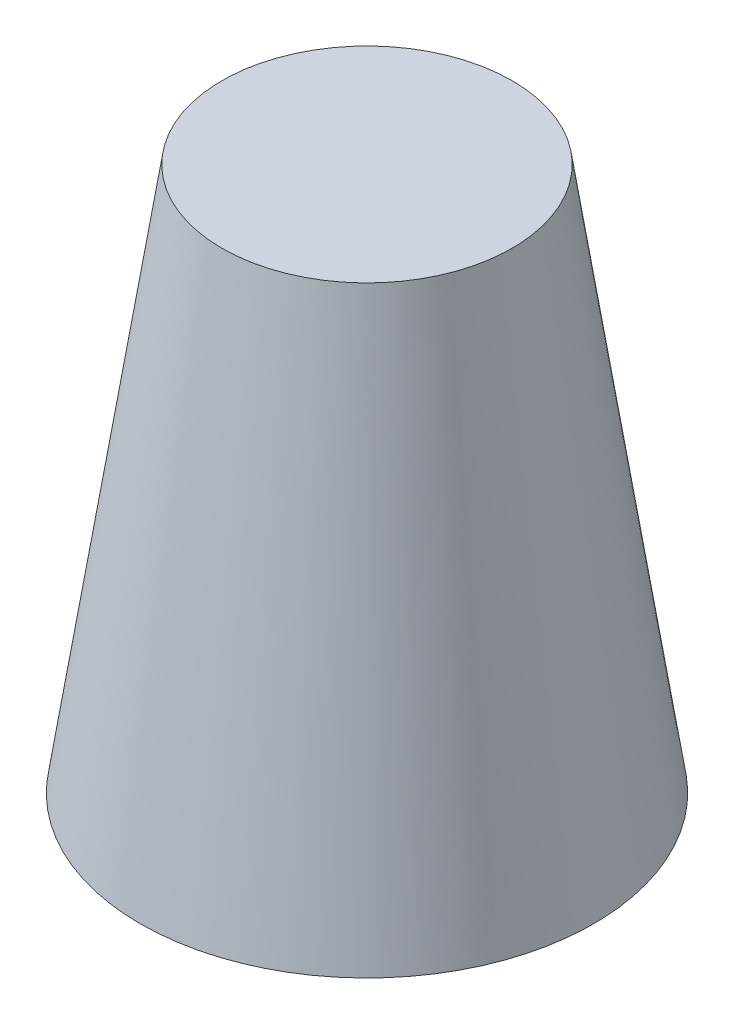
ISO-10303-21;
HEADER;
FILE_DESCRIPTION(('STEP AP214'),'2;1');
FILE_NAME('part.step','',(''),(''),'','','');
FILE_SCHEMA(('AUTOMOTIVE_DESIGN { 1 0 10303 214 1 1 1 1 }'));
ENDSEC;
DATA;
#1=APPLICATION_CONTEXT('core data for automotive mechanical design processes');
#2=APPLICATION_PROTOCOL_DEFINITION('international standard','automotive_design',2000,#1);
#3=PRODUCT_CONTEXT('',#1,'mechanical');
#4=PRODUCT('Part','Part','',(#3));
#5=PRODUCT_RELATED_PRODUCT_CATEGORY('part','',(#4));
#6=PRODUCT_DEFINITION_FORMATION('','',#4);
#7=PRODUCT_DEFINITION_CONTEXT('part definition',#1,'design');
#8=PRODUCT_DEFINITION('design','',#6,#7);
#9=PRODUCT_DEFINITION_SHAPE('','',#8);
#10=(LENGTH_UNIT() NAMED_UNIT(*) SI_UNIT(.MILLI.,.METRE.));
#11=(NAMED_UNIT(*) PLANE_ANGLE_UNIT() SI_UNIT($,.RADIAN.));
#12=(NAMED_UNIT(*) SI_UNIT($,.STERADIAN.) SOLID_ANGLE_UNIT());
#13=UNCERTAINTY_MEASURE_WITH_UNIT(LENGTH_MEASURE(1.E-05),#10,'distance_accuracy_value','');
#14=(GEOMETRIC_REPRESENTATION_CONTEXT(3) GLOBAL_UNCERTAINTY_ASSIGNED_CONTEXT((#13)) GLOBAL_UNIT_ASSIGNED_CONTEXT((#10,
#11,#12)) REPRESENTATION_CONTEXT('',''));
#15=CARTESIAN_POINT('',(0.,0.,0.));
#16=DIRECTION('',(0.,0.,1.));
#17=DIRECTION('',(1.,0.,0.));
#18=AXIS2_PLACEMENT_3D('',#15,#16,#17);
#19=CARTESIAN_POINT('',(0.,3.,0.));
#20=DIRECTION('',(0.,-1.,0.));
#21=DIRECTION('',(0.,0.,-1.));
#22=AXIS2_PLACEMENT_3D('',#19,#20,#21);
#23=CONICAL_SURFACE('',#22,21.5164377375765,0.148889947609497);
#24=CARTESIAN_POINT('',(0.,57.,0.));
#25=DIRECTION('',(0.,1.,0.));
#26=DIRECTION('',(0.,0.,1.));
#27=AXIS2_PLACEMENT_3D('',#24,#25,#26);
#28=CIRCLE('',#27,13.4164377375765);
#29=CARTESIAN_POINT('',(0.,57.,13.4164377375765));
#30=VERTEX_POINT('',#29);
#31=EDGE_CURVE('E63',#30,#30,#28,.T.);
#32=ORIENTED_EDGE('',*,*,#31,.T.);
#33=EDGE_LOOP('',(#32));
#34=FACE_BOUND('',#33,.T.);
#35=CARTESIAN_POINT('',(0.,3.,0.));
#36=DIRECTION('',(0.,1.,0.));
#37=DIRECTION('',(0.,0.,1.));
#38=AXIS2_PLACEMENT_3D('',#35,#36,#37);
#39=CIRCLE('',#38,21.5164377375765);
#40=CARTESIAN_POINT('',(0.,3.,21.5164377375765));
#41=VERTEX_POINT('',#40);
#42=EDGE_CURVE('E10',#41,#41,#39,.T.);
#43=ORIENTED_EDGE('',*,*,#42,.F.);
#44=EDGE_LOOP('',(#43));
#45=FACE_BOUND('',#44,.T.);
#46=ADVANCED_FACE('F41',(#34,#45),#23,.F.);
#47=CARTESIAN_POINT('',(0.,3.,0.));
#48=DIRECTION('',(0.,1.,0.));
#49=DIRECTION('',(0.,0.,1.));
#50=AXIS2_PLACEMENT_3D('',#47,#48,#49);
#51=PLANE('',#50);
#52=ORIENTED_EDGE('',*,*,#42,.T.);
#53=EDGE_LOOP('',(#52));
#54=FACE_BOUND('',#53,.T.);
#55=CARTESIAN_POINT('',(0.,3.,0.));
#56=DIRECTION('',(0.,1.,0.));
#57=DIRECTION('',(0.,0.,1.));
#58=AXIS2_PLACEMENT_3D('',#55,#56,#57);
#59=CIRCLE('',#58,5.00000000000001);
#60=CARTESIAN_POINT('',(0.,3.,5.00000000000001));
#61=VERTEX_POINT('',#60);
#62=EDGE_CURVE('E47',#61,#61,#59,.T.);
#63=ORIENTED_EDGE('',*,*,#62,.F.);
#64=EDGE_LOOP('',(#63));
#65=FACE_BOUND('',#64,.T.);
#66=ADVANCED_FACE('F80',(#54,#65),#51,.T.);
#67=CARTESIAN_POINT('',(0.,60.,0.));
#68=DIRECTION('',(0.,1.,0.));
#69=DIRECTION('',(0.,0.,1.));
#70=AXIS2_PLACEMENT_3D('',#67,#68,#69);
#71=CYLINDRICAL_SURFACE('',#70,5.00000000000001);
#72=CARTESIAN_POINT('',(0.,0.,0.));
#73=DIRECTION('',(0.,1.,0.));
#74=DIRECTION('',(0.,0.,1.));
#75=AXIS2_PLACEMENT_3D('',#72,#73,#74);
#76=CIRCLE('',#75,5.00000000000001);
#77=CARTESIAN_POINT('',(0.,0.,5.00000000000001));
#78=VERTEX_POINT('',#77);
#79=EDGE_CURVE('E51',#78,#78,#76,.T.);
#80=ORIENTED_EDGE('',*,*,#79,.F.);
#81=EDGE_LOOP('',(#80));
#82=FACE_BOUND('',#81,.T.);
#83=ORIENTED_EDGE('',*,*,#62,.T.);
#84=EDGE_LOOP('',(#83));
#85=FACE_BOUND('',#84,.T.);
#86=ADVANCED_FACE('F84',(#82,#85),#71,.F.);
#87=CARTESIAN_POINT('',(0.,0.,0.));
#88=DIRECTION('',(0.,1.,0.));
#89=DIRECTION('',(0.,0.,1.));
#90=AXIS2_PLACEMENT_3D('',#87,#88,#89);
#91=PLANE('',#90);
#92=CARTESIAN_POINT('',(0.,0.,0.));
#93=DIRECTION('',(0.,1.,0.));
#94=DIRECTION('',(0.,0.,1.));
#95=AXIS2_PLACEMENT_3D('',#92,#93,#94);
#96=CIRCLE('',#95,25.);
#97=CARTESIAN_POINT('',(0.,0.,25.));
#98=VERTEX_POINT('',#97);
#99=EDGE_CURVE('E55',#98,#98,#96,.T.);
#100=ORIENTED_EDGE('',*,*,#99,.F.);
#101=EDGE_LOOP('',(#100));
#102=FACE_BOUND('',#101,.T.);
#103=ORIENTED_EDGE('',*,*,#79,.T.);
#104=EDGE_LOOP('',(#103));
#105=FACE_BOUND('',#104,.T.);
#106=ADVANCED_FACE('F88',(#102,#105),#91,.F.);
#107=CARTESIAN_POINT('',(0.,0.,0.));
#108=DIRECTION('',(0.,-1.,0.));
#109=DIRECTION('',(0.,0.,-1.));
#110=AXIS2_PLACEMENT_3D('',#107,#108,#109);
#111=CONICAL_SURFACE('',#110,25.,0.148889947609497);
#112=CARTESIAN_POINT('',(0.,60.,0.));
#113=DIRECTION('',(0.,1.,0.));
#114=DIRECTION('',(0.,0.,1.));
#115=AXIS2_PLACEMENT_3D('',#112,#113,#114);
#116=CIRCLE('',#115,16.);
#117=CARTESIAN_POINT('',(0.,60.,16.));
#118=VERTEX_POINT('',#117);
#119=EDGE_CURVE('E60',#118,#118,#116,.T.);
#120=ORIENTED_EDGE('',*,*,#119,.F.);
#121=EDGE_LOOP('',(#120));
#122=FACE_BOUND('',#121,.T.);
#123=ORIENTED_EDGE('',*,*,#99,.T.);
#124=EDGE_LOOP('',(#123));
#125=FACE_BOUND('',#124,.T.);
#126=ADVANCED_FACE('F76',(#122,#125),#111,.T.);
#127=CARTESIAN_POINT('',(0.,60.,0.));
#128=DIRECTION('',(0.,-1.,0.));
#129=DIRECTION('',(0.,0.,-1.));
#130=AXIS2_PLACEMENT_3D('',#127,#128,#129);
#131=PLANE('',#130);
#132=ORIENTED_EDGE('',*,*,#119,.T.);
#133=EDGE_LOOP('',(#132));
#134=FACE_BOUND('',#133,.T.);
#135=ADVANCED_FACE('F71',(#134),#131,.F.);
#136=CARTESIAN_POINT('',(0.,57.,0.));
#137=DIRECTION('',(0.,-1.,0.));
#138=DIRECTION('',(0.,0.,-1.));
#139=AXIS2_PLACEMENT_3D('',#136,#137,#138);
#140=PLANE('',#139);
#141=ORIENTED_EDGE('',*,*,#31,.F.);
#142=EDGE_LOOP('',(#141));
#143=FACE_BOUND('',#142,.T.);
#144=ADVANCED_FACE('F69',(#143),#140,.T.);
#145=CLOSED_SHELL('',(#46,#66,#86,#106,#126,#135,#144));
#146=MANIFOLD_SOLID_BREP('B2',#145);
#147=ADVANCED_BREP_SHAPE_REPRESENTATION('',(#18,#146),#14);
#148=SHAPE_DEFINITION_REPRESENTATION(#9,#147);
ENDSEC;
END-ISO-10303-21;
